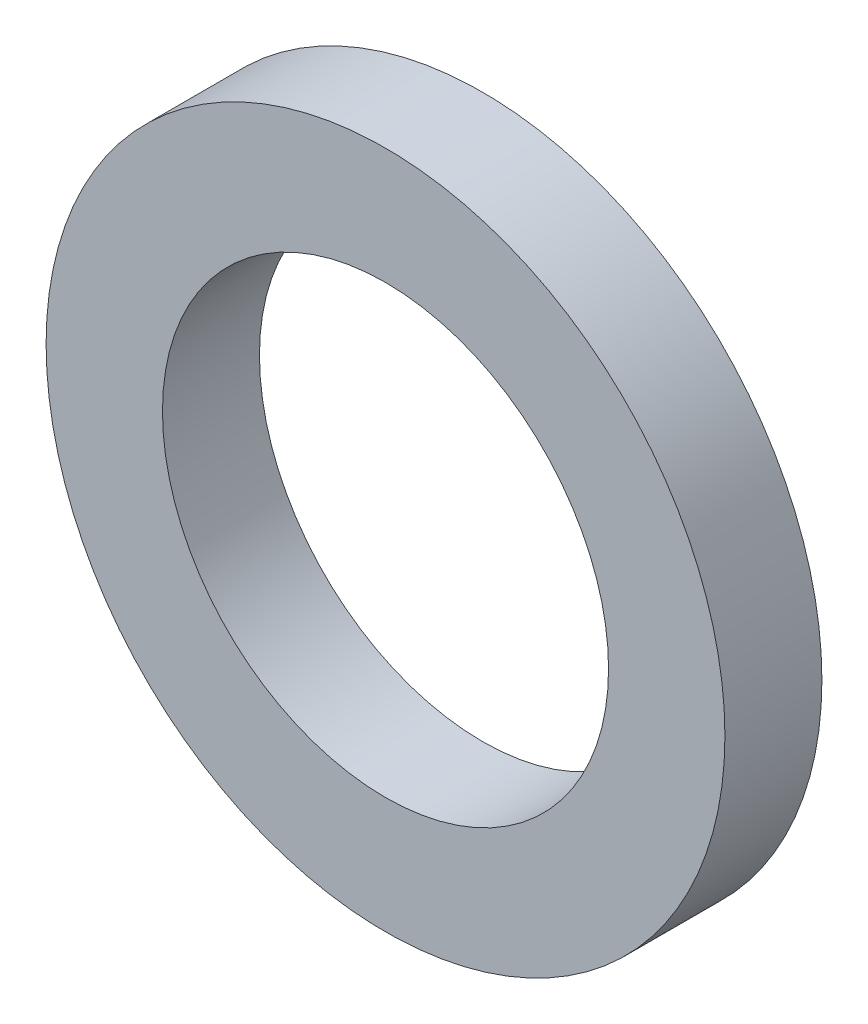
ISO-10303-21;
HEADER;
FILE_DESCRIPTION(('STEP AP214'),'2;1');
FILE_NAME('part.step','',(''),(''),'','','');
FILE_SCHEMA(('AUTOMOTIVE_DESIGN { 1 0 10303 214 1 1 1 1 }'));
ENDSEC;
DATA;
#1=APPLICATION_CONTEXT('core data for automotive mechanical design processes');
#2=APPLICATION_PROTOCOL_DEFINITION('international standard','automotive_design',2000,#1);
#3=PRODUCT_CONTEXT('',#1,'mechanical');
#4=PRODUCT('Part','Part','',(#3));
#5=PRODUCT_RELATED_PRODUCT_CATEGORY('part','',(#4));
#6=PRODUCT_DEFINITION_FORMATION('','',#4);
#7=PRODUCT_DEFINITION_CONTEXT('part definition',#1,'design');
#8=PRODUCT_DEFINITION('design','',#6,#7);
#9=PRODUCT_DEFINITION_SHAPE('','',#8);
#10=(LENGTH_UNIT() NAMED_UNIT(*) SI_UNIT(.MILLI.,.METRE.));
#11=(NAMED_UNIT(*) PLANE_ANGLE_UNIT() SI_UNIT($,.RADIAN.));
#12=(NAMED_UNIT(*) SI_UNIT($,.STERADIAN.) SOLID_ANGLE_UNIT());
#13=UNCERTAINTY_MEASURE_WITH_UNIT(LENGTH_MEASURE(1.E-05),#10,'distance_accuracy_value','');
#14=(GEOMETRIC_REPRESENTATION_CONTEXT(3) GLOBAL_UNCERTAINTY_ASSIGNED_CONTEXT((#13)) GLOBAL_UNIT_ASSIGNED_CONTEXT((#10,
#11,#12)) REPRESENTATION_CONTEXT('',''));
#15=CARTESIAN_POINT('',(0.,0.,0.));
#16=DIRECTION('',(0.,0.,1.));
#17=DIRECTION('',(1.,0.,0.));
#18=AXIS2_PLACEMENT_3D('',#15,#16,#17);
#19=CARTESIAN_POINT('',(0.,0.,5.));
#20=DIRECTION('',(0.,0.,1.));
#21=DIRECTION('',(1.,0.,0.));
#22=AXIS2_PLACEMENT_3D('',#19,#20,#21);
#23=PLANE('',#22);
#24=CARTESIAN_POINT('',(0.,0.,5.));
#25=DIRECTION('',(0.,0.,1.));
#26=DIRECTION('',(1.,0.,0.));
#27=AXIS2_PLACEMENT_3D('',#24,#25,#26);
#28=CIRCLE('',#27,17.5);
#29=CARTESIAN_POINT('',(17.5,0.,5.));
#30=VERTEX_POINT('',#29);
#31=EDGE_CURVE('E10',#30,#30,#28,.T.);
#32=ORIENTED_EDGE('',*,*,#31,.T.);
#33=EDGE_LOOP('',(#32));
#34=FACE_BOUND('',#33,.T.);
#35=CARTESIAN_POINT('',(0.,0.,5.));
#36=DIRECTION('',(0.,0.,1.));
#37=DIRECTION('',(1.,0.,0.));
#38=AXIS2_PLACEMENT_3D('',#35,#36,#37);
#39=CIRCLE('',#38,11.5);
#40=CARTESIAN_POINT('',(11.5,0.,5.));
#41=VERTEX_POINT('',#40);
#42=EDGE_CURVE('E56',#41,#41,#39,.T.);
#43=ORIENTED_EDGE('',*,*,#42,.F.);
#44=EDGE_LOOP('',(#43));
#45=FACE_BOUND('',#44,.T.);
#46=ADVANCED_FACE('F43',(#34,#45),#23,.T.);
#47=CARTESIAN_POINT('',(0.,0.,0.));
#48=DIRECTION('',(0.,0.,1.));
#49=DIRECTION('',(1.,0.,0.));
#50=AXIS2_PLACEMENT_3D('',#47,#48,#49);
#51=PLANE('',#50);
#52=CARTESIAN_POINT('',(0.,0.,0.));
#53=DIRECTION('',(0.,0.,1.));
#54=DIRECTION('',(1.,0.,0.));
#55=AXIS2_PLACEMENT_3D('',#52,#53,#54);
#56=CIRCLE('',#55,17.5);
#57=CARTESIAN_POINT('',(17.5,0.,0.));
#58=VERTEX_POINT('',#57);
#59=EDGE_CURVE('E47',#58,#58,#56,.T.);
#60=ORIENTED_EDGE('',*,*,#59,.F.);
#61=EDGE_LOOP('',(#60));
#62=FACE_BOUND('',#61,.T.);
#63=CARTESIAN_POINT('',(0.,0.,0.));
#64=DIRECTION('',(0.,0.,1.));
#65=DIRECTION('',(1.,0.,0.));
#66=AXIS2_PLACEMENT_3D('',#63,#64,#65);
#67=CIRCLE('',#66,11.5);
#68=CARTESIAN_POINT('',(11.5,0.,0.));
#69=VERTEX_POINT('',#68);
#70=EDGE_CURVE('E58',#69,#69,#67,.T.);
#71=ORIENTED_EDGE('',*,*,#70,.T.);
#72=EDGE_LOOP('',(#71));
#73=FACE_BOUND('',#72,.T.);
#74=ADVANCED_FACE('F70',(#62,#73),#51,.F.);
#75=CARTESIAN_POINT('',(0.,0.,5.));
#76=DIRECTION('',(0.,0.,-1.));
#77=DIRECTION('',(-1.,0.,0.));
#78=AXIS2_PLACEMENT_3D('',#75,#76,#77);
#79=CYLINDRICAL_SURFACE('',#78,17.5);
#80=ORIENTED_EDGE('',*,*,#31,.F.);
#81=EDGE_LOOP('',(#80));
#82=FACE_BOUND('',#81,.T.);
#83=ORIENTED_EDGE('',*,*,#59,.T.);
#84=EDGE_LOOP('',(#83));
#85=FACE_BOUND('',#84,.T.);
#86=ADVANCED_FACE('F45',(#82,#85),#79,.T.);
#87=CARTESIAN_POINT('',(0.,0.,5.));
#88=DIRECTION('',(0.,0.,-1.));
#89=DIRECTION('',(-1.,0.,0.));
#90=AXIS2_PLACEMENT_3D('',#87,#88,#89);
#91=CYLINDRICAL_SURFACE('',#90,11.5);
#92=ORIENTED_EDGE('',*,*,#42,.T.);
#93=EDGE_LOOP('',(#92));
#94=FACE_BOUND('',#93,.T.);
#95=ORIENTED_EDGE('',*,*,#70,.F.);
#96=EDGE_LOOP('',(#95));
#97=FACE_BOUND('',#96,.T.);
#98=ADVANCED_FACE('F66',(#94,#97),#91,.F.);
#99=CLOSED_SHELL('',(#46,#74,#86,#98));
#100=MANIFOLD_SOLID_BREP('B2',#99);
#101=ADVANCED_BREP_SHAPE_REPRESENTATION('',(#18,#100),#14);
#102=SHAPE_DEFINITION_REPRESENTATION(#9,#101);
ENDSEC;
END-ISO-10303-21;
